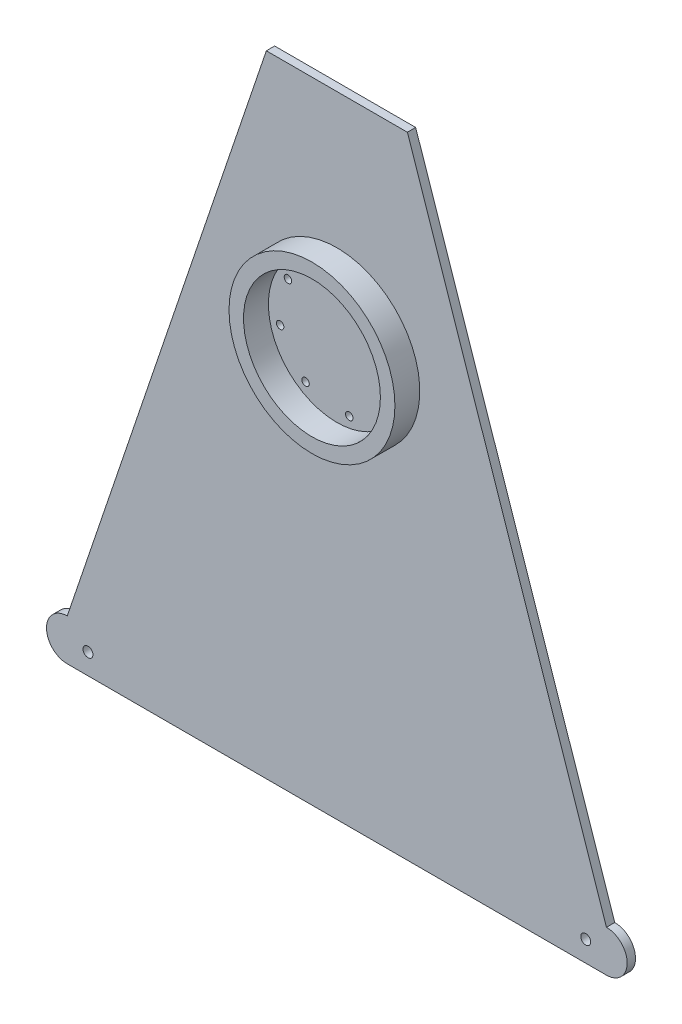
ISO-10303-21;
HEADER;
FILE_DESCRIPTION(('STEP AP214'),'2;1');
FILE_NAME('part.step','',(''),(''),'','','');
FILE_SCHEMA(('AUTOMOTIVE_DESIGN { 1 0 10303 214 1 1 1 1 }'));
ENDSEC;
DATA;
#1=APPLICATION_CONTEXT('core data for automotive mechanical design processes');
#2=APPLICATION_PROTOCOL_DEFINITION('international standard','automotive_design',2000,#1);
#3=PRODUCT_CONTEXT('',#1,'mechanical');
#4=PRODUCT('Part','Part','',(#3));
#5=PRODUCT_RELATED_PRODUCT_CATEGORY('part','',(#4));
#6=PRODUCT_DEFINITION_FORMATION('','',#4);
#7=PRODUCT_DEFINITION_CONTEXT('part definition',#1,'design');
#8=PRODUCT_DEFINITION('design','',#6,#7);
#9=PRODUCT_DEFINITION_SHAPE('','',#8);
#10=(LENGTH_UNIT() NAMED_UNIT(*) SI_UNIT(.MILLI.,.METRE.));
#11=(NAMED_UNIT(*) PLANE_ANGLE_UNIT() SI_UNIT($,.RADIAN.));
#12=(NAMED_UNIT(*) SI_UNIT($,.STERADIAN.) SOLID_ANGLE_UNIT());
#13=UNCERTAINTY_MEASURE_WITH_UNIT(LENGTH_MEASURE(1.E-05),#10,'distance_accuracy_value','');
#14=(GEOMETRIC_REPRESENTATION_CONTEXT(3) GLOBAL_UNCERTAINTY_ASSIGNED_CONTEXT((#13)) GLOBAL_UNIT_ASSIGNED_CONTEXT((#10,
#11,#12)) REPRESENTATION_CONTEXT('',''));
#15=CARTESIAN_POINT('',(0.,0.,0.));
#16=DIRECTION('',(0.,0.,1.));
#17=DIRECTION('',(1.,0.,0.));
#18=AXIS2_PLACEMENT_3D('',#15,#16,#17);
#19=CARTESIAN_POINT('',(325.,0.,10.));
#20=DIRECTION('',(0.,0.,-1.));
#21=DIRECTION('',(-1.,0.,0.));
#22=AXIS2_PLACEMENT_3D('',#19,#20,#21);
#23=CYLINDRICAL_SURFACE('',#22,25.);
#24=DIRECTION('',(0.,0.,-1.));
#25=VECTOR('',#24,1.);
#26=CARTESIAN_POINT('',(325.,25.,10.));
#27=LINE('',#26,#25);
#28=CARTESIAN_POINT('',(325.,25.,10.));
#29=VERTEX_POINT('',#28);
#30=CARTESIAN_POINT('',(325.,25.,0.));
#31=VERTEX_POINT('',#30);
#32=EDGE_CURVE('E118',#29,#31,#27,.T.);
#33=ORIENTED_EDGE('',*,*,#32,.F.);
#34=CARTESIAN_POINT('',(325.,0.,10.));
#35=DIRECTION('',(0.,0.,-1.));
#36=DIRECTION('',(-1.,0.,0.));
#37=AXIS2_PLACEMENT_3D('',#34,#35,#36);
#38=CIRCLE('',#37,25.);
#39=CARTESIAN_POINT('',(325.,-25.,10.));
#40=VERTEX_POINT('',#39);
#41=EDGE_CURVE('E63',#40,#29,#38,.F.);
#42=ORIENTED_EDGE('',*,*,#41,.F.);
#43=DIRECTION('',(0.,0.,-1.));
#44=VECTOR('',#43,1.);
#45=CARTESIAN_POINT('',(325.,-25.,10.));
#46=LINE('',#45,#44);
#47=CARTESIAN_POINT('',(325.,-25.,0.));
#48=VERTEX_POINT('',#47);
#49=EDGE_CURVE('E173',#48,#40,#46,.F.);
#50=ORIENTED_EDGE('',*,*,#49,.F.);
#51=CARTESIAN_POINT('',(325.,0.,0.));
#52=DIRECTION('',(0.,0.,-1.));
#53=DIRECTION('',(-1.,0.,0.));
#54=AXIS2_PLACEMENT_3D('',#51,#52,#53);
#55=CIRCLE('',#54,25.);
#56=EDGE_CURVE('E50',#31,#48,#55,.T.);
#57=ORIENTED_EDGE('',*,*,#56,.F.);
#58=EDGE_LOOP('',(#33,#42,#50,#57));
#59=FACE_BOUND('',#58,.T.);
#60=ADVANCED_FACE('F41',(#59),#23,.T.);
#61=CARTESIAN_POINT('',(-325.,0.,0.));
#62=DIRECTION('',(0.,0.,-1.));
#63=DIRECTION('',(-1.,0.,0.));
#64=AXIS2_PLACEMENT_3D('',#61,#62,#63);
#65=CYLINDRICAL_SURFACE('',#64,25.);
#66=DIRECTION('',(0.,0.,-1.));
#67=VECTOR('',#66,1.);
#68=CARTESIAN_POINT('',(-325.,25.,10.));
#69=LINE('',#68,#67);
#70=CARTESIAN_POINT('',(-325.,25.,0.));
#71=VERTEX_POINT('',#70);
#72=CARTESIAN_POINT('',(-325.,25.,10.));
#73=VERTEX_POINT('',#72);
#74=EDGE_CURVE('E154',#71,#73,#69,.F.);
#75=ORIENTED_EDGE('',*,*,#74,.F.);
#76=CARTESIAN_POINT('',(-325.,0.,0.));
#77=DIRECTION('',(0.,0.,-1.));
#78=DIRECTION('',(-1.,0.,0.));
#79=AXIS2_PLACEMENT_3D('',#76,#77,#78);
#80=CIRCLE('',#79,25.);
#81=CARTESIAN_POINT('',(-325.,-25.,0.));
#82=VERTEX_POINT('',#81);
#83=EDGE_CURVE('E165',#82,#71,#80,.T.);
#84=ORIENTED_EDGE('',*,*,#83,.F.);
#85=DIRECTION('',(0.,0.,-1.));
#86=VECTOR('',#85,1.);
#87=CARTESIAN_POINT('',(-325.,-25.,10.));
#88=LINE('',#87,#86);
#89=CARTESIAN_POINT('',(-325.,-25.,10.));
#90=VERTEX_POINT('',#89);
#91=EDGE_CURVE('E161',#90,#82,#88,.T.);
#92=ORIENTED_EDGE('',*,*,#91,.F.);
#93=CARTESIAN_POINT('',(-325.,0.,10.));
#94=DIRECTION('',(0.,0.,-1.));
#95=DIRECTION('',(-1.,0.,0.));
#96=AXIS2_PLACEMENT_3D('',#93,#94,#95);
#97=CIRCLE('',#96,25.);
#98=EDGE_CURVE('E168',#73,#90,#97,.F.);
#99=ORIENTED_EDGE('',*,*,#98,.F.);
#100=EDGE_LOOP('',(#75,#84,#92,#99));
#101=FACE_BOUND('',#100,.T.);
#102=ADVANCED_FACE('F308',(#101),#65,.T.);
#103=CARTESIAN_POINT('',(0.,0.,10.));
#104=DIRECTION('',(0.,0.,-1.));
#105=DIRECTION('',(-1.,0.,0.));
#106=AXIS2_PLACEMENT_3D('',#103,#104,#105);
#107=PLANE('',#106);
#108=CARTESIAN_POINT('',(0.,472.,10.));
#109=DIRECTION('',(0.,0.,-1.));
#110=DIRECTION('',(-1.,0.,0.));
#111=AXIS2_PLACEMENT_3D('',#108,#109,#110);
#112=CIRCLE('',#111,100.);
#113=CARTESIAN_POINT('',(-100.,472.,10.));
#114=VERTEX_POINT('',#113);
#115=EDGE_CURVE('E11',#114,#114,#112,.F.);
#116=ORIENTED_EDGE('',*,*,#115,.F.);
#117=EDGE_LOOP('',(#116));
#118=FACE_BOUND('',#117,.T.);
#119=DIRECTION('',(1.,0.,0.));
#120=VECTOR('',#119,1.);
#121=CARTESIAN_POINT('',(-350.,-25.,10.));
#122=LINE('',#121,#120);
#123=EDGE_CURVE('E150',#90,#40,#122,.T.);
#124=ORIENTED_EDGE('',*,*,#123,.T.);
#125=ORIENTED_EDGE('',*,*,#41,.T.);
#126=DIRECTION('',(-0.320227798569515,0.947340570768149,0.));
#127=VECTOR('',#126,1.);
#128=CARTESIAN_POINT('',(85.,735.,10.));
#129=LINE('',#128,#127);
#130=CARTESIAN_POINT('',(85.,735.,10.));
#131=VERTEX_POINT('',#130);
#132=EDGE_CURVE('E127',#29,#131,#129,.T.);
#133=ORIENTED_EDGE('',*,*,#132,.T.);
#134=DIRECTION('',(-1.,0.,0.));
#135=VECTOR('',#134,1.);
#136=CARTESIAN_POINT('',(-85.,735.,10.));
#137=LINE('',#136,#135);
#138=CARTESIAN_POINT('',(-85.,735.,10.));
#139=VERTEX_POINT('',#138);
#140=EDGE_CURVE('E111',#131,#139,#137,.T.);
#141=ORIENTED_EDGE('',*,*,#140,.T.);
#142=DIRECTION('',(-0.320227798569515,-0.947340570768149,0.));
#143=VECTOR('',#142,1.);
#144=CARTESIAN_POINT('',(-325.,25.,10.));
#145=LINE('',#144,#143);
#146=EDGE_CURVE('E120',#139,#73,#145,.T.);
#147=ORIENTED_EDGE('',*,*,#146,.T.);
#148=ORIENTED_EDGE('',*,*,#98,.T.);
#149=EDGE_LOOP('',(#124,#125,#133,#141,#147,#148));
#150=FACE_BOUND('',#149,.T.);
#151=CARTESIAN_POINT('',(-300.,0.,10.));
#152=DIRECTION('',(0.,0.,1.));
#153=DIRECTION('',(1.,0.,0.));
#154=AXIS2_PLACEMENT_3D('',#151,#152,#153);
#155=CIRCLE('',#154,5.99999999999999);
#156=CARTESIAN_POINT('',(-294.,0.,10.));
#157=VERTEX_POINT('',#156);
#158=EDGE_CURVE('E142',#157,#157,#155,.T.);
#159=ORIENTED_EDGE('',*,*,#158,.F.);
#160=EDGE_LOOP('',(#159));
#161=FACE_BOUND('',#160,.T.);
#162=CARTESIAN_POINT('',(300.,0.,10.));
#163=DIRECTION('',(0.,0.,1.));
#164=DIRECTION('',(1.,0.,0.));
#165=AXIS2_PLACEMENT_3D('',#162,#163,#164);
#166=CIRCLE('',#165,5.99999999999999);
#167=CARTESIAN_POINT('',(306.,0.,10.));
#168=VERTEX_POINT('',#167);
#169=EDGE_CURVE('E134',#168,#168,#166,.T.);
#170=ORIENTED_EDGE('',*,*,#169,.F.);
#171=EDGE_LOOP('',(#170));
#172=FACE_BOUND('',#171,.T.);
#173=ADVANCED_FACE('F179',(#118,#150,#161,#172),#107,.F.);
#174=CARTESIAN_POINT('',(0.,0.,0.));
#175=DIRECTION('',(0.,0.,-1.));
#176=DIRECTION('',(-1.,0.,0.));
#177=AXIS2_PLACEMENT_3D('',#174,#175,#176);
#178=PLANE('',#177);
#179=CARTESIAN_POINT('',(15.0022039899516,403.626511896468,0.));
#180=DIRECTION('',(0.,0.,1.));
#181=DIRECTION('',(0.707106781186546,0.707106781186549,0.));
#182=AXIS2_PLACEMENT_3D('',#179,#180,#181);
#183=CIRCLE('',#182,4.5);
#184=CARTESIAN_POINT('',(18.184184505291,406.808492411807,0.));
#185=VERTEX_POINT('',#184);
#186=EDGE_CURVE('E204',#185,#185,#183,.T.);
#187=ORIENTED_EDGE('',*,*,#186,.T.);
#188=EDGE_LOOP('',(#187));
#189=FACE_BOUND('',#188,.T.);
#190=CARTESIAN_POINT('',(58.9555172654241,434.260803082653,0.));
#191=DIRECTION('',(0.,0.,1.));
#192=DIRECTION('',(0.,1.,0.));
#193=AXIS2_PLACEMENT_3D('',#190,#191,#192);
#194=CIRCLE('',#193,4.5);
#195=CARTESIAN_POINT('',(58.9555172654241,438.760803082653,0.));
#196=VERTEX_POINT('',#195);
#197=EDGE_CURVE('E252',#196,#196,#194,.T.);
#198=ORIENTED_EDGE('',*,*,#197,.T.);
#199=EDGE_LOOP('',(#198));
#200=FACE_BOUND('',#199,.T.);
#201=CARTESIAN_POINT('',(68.3734881035323,487.002203989952,0.));
#202=DIRECTION('',(0.,0.,1.));
#203=DIRECTION('',(-0.707106781186551,0.707106781186544,0.));
#204=AXIS2_PLACEMENT_3D('',#201,#202,#203);
#205=CIRCLE('',#204,4.5);
#206=CARTESIAN_POINT('',(65.1915075881928,490.184184505291,0.));
#207=VERTEX_POINT('',#206);
#208=EDGE_CURVE('E244',#207,#207,#205,.T.);
#209=ORIENTED_EDGE('',*,*,#208,.T.);
#210=EDGE_LOOP('',(#209));
#211=FACE_BOUND('',#210,.T.);
#212=CARTESIAN_POINT('',(37.739196917347,530.955517265424,0.));
#213=DIRECTION('',(0.,0.,1.));
#214=DIRECTION('',(-1.,0.,0.));
#215=AXIS2_PLACEMENT_3D('',#212,#213,#214);
#216=CIRCLE('',#215,4.5);
#217=CARTESIAN_POINT('',(33.239196917347,530.955517265424,0.));
#218=VERTEX_POINT('',#217);
#219=EDGE_CURVE('E236',#218,#218,#216,.T.);
#220=ORIENTED_EDGE('',*,*,#219,.T.);
#221=EDGE_LOOP('',(#220));
#222=FACE_BOUND('',#221,.T.);
#223=CARTESIAN_POINT('',(-15.002203989952,540.373488103532,0.));
#224=DIRECTION('',(0.,0.,1.));
#225=DIRECTION('',(-0.707106781186541,-0.707106781186554,0.));
#226=AXIS2_PLACEMENT_3D('',#223,#224,#225);
#227=CIRCLE('',#226,4.5);
#228=CARTESIAN_POINT('',(-18.1841845052914,537.191507588193,0.));
#229=VERTEX_POINT('',#228);
#230=EDGE_CURVE('E228',#229,#229,#227,.T.);
#231=ORIENTED_EDGE('',*,*,#230,.T.);
#232=EDGE_LOOP('',(#231));
#233=FACE_BOUND('',#232,.T.);
#234=CARTESIAN_POINT('',(-58.9555172654244,509.739196917346,0.));
#235=DIRECTION('',(0.,0.,1.));
#236=DIRECTION('',(0.,-1.,0.));
#237=AXIS2_PLACEMENT_3D('',#234,#235,#236);
#238=CIRCLE('',#237,4.5);
#239=CARTESIAN_POINT('',(-58.9555172654244,505.239196917346,0.));
#240=VERTEX_POINT('',#239);
#241=EDGE_CURVE('E220',#240,#240,#238,.T.);
#242=ORIENTED_EDGE('',*,*,#241,.T.);
#243=EDGE_LOOP('',(#242));
#244=FACE_BOUND('',#243,.T.);
#245=CARTESIAN_POINT('',(-68.3734881035322,456.997796010048,0.));
#246=DIRECTION('',(0.,0.,1.));
#247=DIRECTION('',(0.707106781186556,-0.707106781186539,0.));
#248=AXIS2_PLACEMENT_3D('',#245,#246,#247);
#249=CIRCLE('',#248,4.5);
#250=CARTESIAN_POINT('',(-65.1915075881927,453.815815494708,0.));
#251=VERTEX_POINT('',#250);
#252=EDGE_CURVE('E212',#251,#251,#249,.T.);
#253=ORIENTED_EDGE('',*,*,#252,.T.);
#254=EDGE_LOOP('',(#253));
#255=FACE_BOUND('',#254,.T.);
#256=CARTESIAN_POINT('',(-37.739196917347,413.044482734576,0.));
#257=DIRECTION('',(0.,0.,1.));
#258=DIRECTION('',(1.,0.,0.));
#259=AXIS2_PLACEMENT_3D('',#256,#257,#258);
#260=CIRCLE('',#259,4.5);
#261=CARTESIAN_POINT('',(-33.239196917347,413.044482734576,0.));
#262=VERTEX_POINT('',#261);
#263=EDGE_CURVE('E198',#262,#262,#260,.T.);
#264=ORIENTED_EDGE('',*,*,#263,.T.);
#265=EDGE_LOOP('',(#264));
#266=FACE_BOUND('',#265,.T.);
#267=CARTESIAN_POINT('',(-300.,0.,0.));
#268=DIRECTION('',(0.,0.,1.));
#269=DIRECTION('',(1.,0.,0.));
#270=AXIS2_PLACEMENT_3D('',#267,#268,#269);
#271=CIRCLE('',#270,5.99999999999999);
#272=CARTESIAN_POINT('',(-294.,0.,0.));
#273=VERTEX_POINT('',#272);
#274=EDGE_CURVE('E138',#273,#273,#271,.T.);
#275=ORIENTED_EDGE('',*,*,#274,.T.);
#276=EDGE_LOOP('',(#275));
#277=FACE_BOUND('',#276,.T.);
#278=ORIENTED_EDGE('',*,*,#83,.T.);
#279=DIRECTION('',(-0.320227798569515,-0.947340570768149,0.));
#280=VECTOR('',#279,1.);
#281=CARTESIAN_POINT('',(-325.,25.,0.));
#282=LINE('',#281,#280);
#283=CARTESIAN_POINT('',(-85.,735.,0.));
#284=VERTEX_POINT('',#283);
#285=EDGE_CURVE('E101',#284,#71,#282,.T.);
#286=ORIENTED_EDGE('',*,*,#285,.F.);
#287=DIRECTION('',(-1.,0.,0.));
#288=VECTOR('',#287,1.);
#289=CARTESIAN_POINT('',(-85.,735.,0.));
#290=LINE('',#289,#288);
#291=CARTESIAN_POINT('',(85.,735.,0.));
#292=VERTEX_POINT('',#291);
#293=EDGE_CURVE('E93',#292,#284,#290,.T.);
#294=ORIENTED_EDGE('',*,*,#293,.F.);
#295=DIRECTION('',(-0.320227798569515,0.947340570768149,0.));
#296=VECTOR('',#295,1.);
#297=CARTESIAN_POINT('',(85.,735.,0.));
#298=LINE('',#297,#296);
#299=EDGE_CURVE('E98',#31,#292,#298,.T.);
#300=ORIENTED_EDGE('',*,*,#299,.F.);
#301=ORIENTED_EDGE('',*,*,#56,.T.);
#302=DIRECTION('',(1.,0.,0.));
#303=VECTOR('',#302,1.);
#304=CARTESIAN_POINT('',(-350.,-25.,0.));
#305=LINE('',#304,#303);
#306=EDGE_CURVE('E146',#82,#48,#305,.T.);
#307=ORIENTED_EDGE('',*,*,#306,.F.);
#308=EDGE_LOOP('',(#278,#286,#294,#300,#301,#307));
#309=FACE_BOUND('',#308,.T.);
#310=CARTESIAN_POINT('',(300.,0.,0.));
#311=DIRECTION('',(0.,0.,1.));
#312=DIRECTION('',(1.,0.,0.));
#313=AXIS2_PLACEMENT_3D('',#310,#311,#312);
#314=CIRCLE('',#313,5.99999999999999);
#315=CARTESIAN_POINT('',(306.,0.,0.));
#316=VERTEX_POINT('',#315);
#317=EDGE_CURVE('E130',#316,#316,#314,.T.);
#318=ORIENTED_EDGE('',*,*,#317,.T.);
#319=EDGE_LOOP('',(#318));
#320=FACE_BOUND('',#319,.T.);
#321=ADVANCED_FACE('F95',(#189,#200,#211,#222,#233,#244,#255,#266,#277,#309,#320),#178,.T.);
#322=CARTESIAN_POINT('',(-350.,-25.,10.));
#323=DIRECTION('',(0.,1.,0.));
#324=DIRECTION('',(0.,0.,1.));
#325=AXIS2_PLACEMENT_3D('',#322,#323,#324);
#326=PLANE('',#325);
#327=ORIENTED_EDGE('',*,*,#306,.T.);
#328=ORIENTED_EDGE('',*,*,#49,.T.);
#329=ORIENTED_EDGE('',*,*,#123,.F.);
#330=ORIENTED_EDGE('',*,*,#91,.T.);
#331=EDGE_LOOP('',(#327,#328,#329,#330));
#332=FACE_BOUND('',#331,.T.);
#333=ADVANCED_FACE('F322',(#332),#326,.F.);
#334=CARTESIAN_POINT('',(-300.,0.,10.));
#335=DIRECTION('',(0.,0.,-1.));
#336=DIRECTION('',(-1.,0.,0.));
#337=AXIS2_PLACEMENT_3D('',#334,#335,#336);
#338=CYLINDRICAL_SURFACE('',#337,5.99999999999999);
#339=ORIENTED_EDGE('',*,*,#158,.T.);
#340=EDGE_LOOP('',(#339));
#341=FACE_BOUND('',#340,.T.);
#342=ORIENTED_EDGE('',*,*,#274,.F.);
#343=EDGE_LOOP('',(#342));
#344=FACE_BOUND('',#343,.T.);
#345=ADVANCED_FACE('F325',(#341,#344),#338,.F.);
#346=CARTESIAN_POINT('',(300.,0.,10.));
#347=DIRECTION('',(0.,0.,-1.));
#348=DIRECTION('',(-1.,0.,0.));
#349=AXIS2_PLACEMENT_3D('',#346,#347,#348);
#350=CYLINDRICAL_SURFACE('',#349,5.99999999999999);
#351=ORIENTED_EDGE('',*,*,#169,.T.);
#352=EDGE_LOOP('',(#351));
#353=FACE_BOUND('',#352,.T.);
#354=ORIENTED_EDGE('',*,*,#317,.F.);
#355=EDGE_LOOP('',(#354));
#356=FACE_BOUND('',#355,.T.);
#357=ADVANCED_FACE('F331',(#353,#356),#350,.F.);
#358=CARTESIAN_POINT('',(85.,735.,-962.60064408871));
#359=DIRECTION('',(0.947340570768149,0.320227798569515,0.));
#360=DIRECTION('',(-0.320227798569515,0.947340570768149,0.));
#361=AXIS2_PLACEMENT_3D('',#358,#359,#360);
#362=PLANE('',#361);
#363=ORIENTED_EDGE('',*,*,#32,.T.);
#364=ORIENTED_EDGE('',*,*,#299,.T.);
#365=DIRECTION('',(0.,0.,1.));
#366=VECTOR('',#365,1.);
#367=CARTESIAN_POINT('',(85.,735.,-962.60064408871));
#368=LINE('',#367,#366);
#369=EDGE_CURVE('E106',#292,#131,#368,.T.);
#370=ORIENTED_EDGE('',*,*,#369,.T.);
#371=ORIENTED_EDGE('',*,*,#132,.F.);
#372=EDGE_LOOP('',(#363,#364,#370,#371));
#373=FACE_BOUND('',#372,.T.);
#374=ADVANCED_FACE('F117',(#373),#362,.T.);
#375=CARTESIAN_POINT('',(-85.,735.,-962.60064408871));
#376=DIRECTION('',(0.,1.,0.));
#377=DIRECTION('',(0.,0.,1.));
#378=AXIS2_PLACEMENT_3D('',#375,#376,#377);
#379=PLANE('',#378);
#380=ORIENTED_EDGE('',*,*,#369,.F.);
#381=ORIENTED_EDGE('',*,*,#293,.T.);
#382=DIRECTION('',(0.,0.,1.));
#383=VECTOR('',#382,1.);
#384=CARTESIAN_POINT('',(-85.,735.,-962.60064408871));
#385=LINE('',#384,#383);
#386=EDGE_CURVE('E105',#284,#139,#385,.T.);
#387=ORIENTED_EDGE('',*,*,#386,.T.);
#388=ORIENTED_EDGE('',*,*,#140,.F.);
#389=EDGE_LOOP('',(#380,#381,#387,#388));
#390=FACE_BOUND('',#389,.T.);
#391=ADVANCED_FACE('F109',(#390),#379,.T.);
#392=CARTESIAN_POINT('',(-325.,25.,-962.60064408871));
#393=DIRECTION('',(-0.947340570768149,0.320227798569515,0.));
#394=DIRECTION('',(-0.320227798569515,-0.947340570768149,0.));
#395=AXIS2_PLACEMENT_3D('',#392,#393,#394);
#396=PLANE('',#395);
#397=ORIENTED_EDGE('',*,*,#386,.F.);
#398=ORIENTED_EDGE('',*,*,#285,.T.);
#399=ORIENTED_EDGE('',*,*,#74,.T.);
#400=ORIENTED_EDGE('',*,*,#146,.F.);
#401=EDGE_LOOP('',(#397,#398,#399,#400));
#402=FACE_BOUND('',#401,.T.);
#403=ADVANCED_FACE('F340',(#402),#396,.T.);
#404=CARTESIAN_POINT('',(0.,472.,40.));
#405=DIRECTION('',(0.,0.,1.));
#406=DIRECTION('',(1.,0.,0.));
#407=AXIS2_PLACEMENT_3D('',#404,#405,#406);
#408=PLANE('',#407);
#409=CARTESIAN_POINT('',(0.,472.,40.));
#410=DIRECTION('',(0.,0.,1.));
#411=DIRECTION('',(1.,0.,0.));
#412=AXIS2_PLACEMENT_3D('',#409,#410,#411);
#413=CIRCLE('',#412,100.);
#414=CARTESIAN_POINT('',(100.,472.,40.));
#415=VERTEX_POINT('',#414);
#416=EDGE_CURVE('E183',#415,#415,#413,.T.);
#417=ORIENTED_EDGE('',*,*,#416,.T.);
#418=EDGE_LOOP('',(#417));
#419=FACE_BOUND('',#418,.T.);
#420=CARTESIAN_POINT('',(0.,472.,40.));
#421=DIRECTION('',(0.,0.,1.));
#422=DIRECTION('',(1.,0.,0.));
#423=AXIS2_PLACEMENT_3D('',#420,#421,#422);
#424=CIRCLE('',#423,82.5);
#425=CARTESIAN_POINT('',(82.5,472.,40.));
#426=VERTEX_POINT('',#425);
#427=EDGE_CURVE('E187',#426,#426,#424,.T.);
#428=ORIENTED_EDGE('',*,*,#427,.F.);
#429=EDGE_LOOP('',(#428));
#430=FACE_BOUND('',#429,.T.);
#431=ADVANCED_FACE('F302',(#419,#430),#408,.T.);
#432=CARTESIAN_POINT('',(0.,472.,40.));
#433=DIRECTION('',(0.,0.,-1.));
#434=DIRECTION('',(-1.,0.,0.));
#435=AXIS2_PLACEMENT_3D('',#432,#433,#434);
#436=CYLINDRICAL_SURFACE('',#435,100.);
#437=ORIENTED_EDGE('',*,*,#416,.F.);
#438=EDGE_LOOP('',(#437));
#439=FACE_BOUND('',#438,.T.);
#440=ORIENTED_EDGE('',*,*,#115,.T.);
#441=EDGE_LOOP('',(#440));
#442=FACE_BOUND('',#441,.T.);
#443=ADVANCED_FACE('F296',(#439,#442),#436,.T.);
#444=CARTESIAN_POINT('',(0.,472.,40.));
#445=DIRECTION('',(0.,0.,-1.));
#446=DIRECTION('',(-1.,0.,0.));
#447=AXIS2_PLACEMENT_3D('',#444,#445,#446);
#448=CYLINDRICAL_SURFACE('',#447,82.5);
#449=ORIENTED_EDGE('',*,*,#427,.T.);
#450=EDGE_LOOP('',(#449));
#451=FACE_BOUND('',#450,.T.);
#452=CARTESIAN_POINT('',(0.,472.,10.));
#453=DIRECTION('',(0.,0.,1.));
#454=DIRECTION('',(1.,0.,0.));
#455=AXIS2_PLACEMENT_3D('',#452,#453,#454);
#456=CIRCLE('',#455,82.5);
#457=CARTESIAN_POINT('',(82.5,472.,10.));
#458=VERTEX_POINT('',#457);
#459=EDGE_CURVE('E193',#458,#458,#456,.T.);
#460=ORIENTED_EDGE('',*,*,#459,.F.);
#461=EDGE_LOOP('',(#460));
#462=FACE_BOUND('',#461,.T.);
#463=ADVANCED_FACE('F277',(#451,#462),#448,.F.);
#464=CARTESIAN_POINT('',(15.0022039899516,403.626511896468,10.));
#465=DIRECTION('',(0.,0.,1.));
#466=DIRECTION('',(0.707106781186546,0.707106781186549,0.));
#467=AXIS2_PLACEMENT_3D('',#464,#465,#466);
#468=CIRCLE('',#467,4.5);
#469=CARTESIAN_POINT('',(18.184184505291,406.808492411807,10.));
#470=VERTEX_POINT('',#469);
#471=EDGE_CURVE('E256',#470,#470,#468,.T.);
#472=ORIENTED_EDGE('',*,*,#471,.F.);
#473=EDGE_LOOP('',(#472));
#474=FACE_BOUND('',#473,.T.);
#475=CARTESIAN_POINT('',(58.9555172654241,434.260803082653,10.));
#476=DIRECTION('',(0.,0.,1.));
#477=DIRECTION('',(0.,1.,0.));
#478=AXIS2_PLACEMENT_3D('',#475,#476,#477);
#479=CIRCLE('',#478,4.5);
#480=CARTESIAN_POINT('',(58.9555172654241,438.760803082653,10.));
#481=VERTEX_POINT('',#480);
#482=EDGE_CURVE('E248',#481,#481,#479,.T.);
#483=ORIENTED_EDGE('',*,*,#482,.F.);
#484=EDGE_LOOP('',(#483));
#485=FACE_BOUND('',#484,.T.);
#486=CARTESIAN_POINT('',(68.3734881035323,487.002203989952,10.));
#487=DIRECTION('',(0.,0.,1.));
#488=DIRECTION('',(-0.707106781186551,0.707106781186544,0.));
#489=AXIS2_PLACEMENT_3D('',#486,#487,#488);
#490=CIRCLE('',#489,4.5);
#491=CARTESIAN_POINT('',(65.1915075881928,490.184184505291,10.));
#492=VERTEX_POINT('',#491);
#493=EDGE_CURVE('E240',#492,#492,#490,.T.);
#494=ORIENTED_EDGE('',*,*,#493,.F.);
#495=EDGE_LOOP('',(#494));
#496=FACE_BOUND('',#495,.T.);
#497=CARTESIAN_POINT('',(37.739196917347,530.955517265424,10.));
#498=DIRECTION('',(0.,0.,1.));
#499=DIRECTION('',(-1.,0.,0.));
#500=AXIS2_PLACEMENT_3D('',#497,#498,#499);
#501=CIRCLE('',#500,4.5);
#502=CARTESIAN_POINT('',(33.239196917347,530.955517265424,10.));
#503=VERTEX_POINT('',#502);
#504=EDGE_CURVE('E232',#503,#503,#501,.T.);
#505=ORIENTED_EDGE('',*,*,#504,.F.);
#506=EDGE_LOOP('',(#505));
#507=FACE_BOUND('',#506,.T.);
#508=CARTESIAN_POINT('',(-15.002203989952,540.373488103532,10.));
#509=DIRECTION('',(0.,0.,1.));
#510=DIRECTION('',(-0.707106781186541,-0.707106781186554,0.));
#511=AXIS2_PLACEMENT_3D('',#508,#509,#510);
#512=CIRCLE('',#511,4.5);
#513=CARTESIAN_POINT('',(-18.1841845052914,537.191507588193,10.));
#514=VERTEX_POINT('',#513);
#515=EDGE_CURVE('E224',#514,#514,#512,.T.);
#516=ORIENTED_EDGE('',*,*,#515,.F.);
#517=EDGE_LOOP('',(#516));
#518=FACE_BOUND('',#517,.T.);
#519=CARTESIAN_POINT('',(-58.9555172654244,509.739196917346,10.));
#520=DIRECTION('',(0.,0.,1.));
#521=DIRECTION('',(0.,-1.,0.));
#522=AXIS2_PLACEMENT_3D('',#519,#520,#521);
#523=CIRCLE('',#522,4.5);
#524=CARTESIAN_POINT('',(-58.9555172654244,505.239196917346,10.));
#525=VERTEX_POINT('',#524);
#526=EDGE_CURVE('E216',#525,#525,#523,.T.);
#527=ORIENTED_EDGE('',*,*,#526,.F.);
#528=EDGE_LOOP('',(#527));
#529=FACE_BOUND('',#528,.T.);
#530=CARTESIAN_POINT('',(-68.3734881035322,456.997796010048,10.));
#531=DIRECTION('',(0.,0.,1.));
#532=DIRECTION('',(0.707106781186556,-0.707106781186539,0.));
#533=AXIS2_PLACEMENT_3D('',#530,#531,#532);
#534=CIRCLE('',#533,4.5);
#535=CARTESIAN_POINT('',(-65.1915075881927,453.815815494708,10.));
#536=VERTEX_POINT('',#535);
#537=EDGE_CURVE('E208',#536,#536,#534,.T.);
#538=ORIENTED_EDGE('',*,*,#537,.F.);
#539=EDGE_LOOP('',(#538));
#540=FACE_BOUND('',#539,.T.);
#541=CARTESIAN_POINT('',(-37.739196917347,413.044482734576,10.));
#542=DIRECTION('',(0.,0.,1.));
#543=DIRECTION('',(1.,0.,0.));
#544=AXIS2_PLACEMENT_3D('',#541,#542,#543);
#545=CIRCLE('',#544,4.5);
#546=CARTESIAN_POINT('',(-33.239196917347,413.044482734576,10.));
#547=VERTEX_POINT('',#546);
#548=EDGE_CURVE('E200',#547,#547,#545,.T.);
#549=ORIENTED_EDGE('',*,*,#548,.F.);
#550=EDGE_LOOP('',(#549));
#551=FACE_BOUND('',#550,.T.);
#552=ORIENTED_EDGE('',*,*,#459,.T.);
#553=EDGE_LOOP('',(#552));
#554=FACE_BOUND('',#553,.T.);
#555=ADVANCED_FACE('F273',(#474,#485,#496,#507,#518,#529,#540,#551,#554),#107,.F.);
#556=CARTESIAN_POINT('',(-37.739196917347,413.044482734576,0.));
#557=DIRECTION('',(0.,0.,1.));
#558=DIRECTION('',(1.,0.,0.));
#559=AXIS2_PLACEMENT_3D('',#556,#557,#558);
#560=CYLINDRICAL_SURFACE('',#559,4.5);
#561=ORIENTED_EDGE('',*,*,#263,.F.);
#562=EDGE_LOOP('',(#561));
#563=FACE_BOUND('',#562,.T.);
#564=ORIENTED_EDGE('',*,*,#548,.T.);
#565=EDGE_LOOP('',(#564));
#566=FACE_BOUND('',#565,.T.);
#567=ADVANCED_FACE('F276',(#563,#566),#560,.F.);
#568=CARTESIAN_POINT('',(-68.3734881035322,456.997796010048,0.));
#569=DIRECTION('',(0.,0.,1.));
#570=DIRECTION('',(1.,0.,0.));
#571=AXIS2_PLACEMENT_3D('',#568,#569,#570);
#572=CYLINDRICAL_SURFACE('',#571,4.5);
#573=ORIENTED_EDGE('',*,*,#252,.F.);
#574=EDGE_LOOP('',(#573));
#575=FACE_BOUND('',#574,.T.);
#576=ORIENTED_EDGE('',*,*,#537,.T.);
#577=EDGE_LOOP('',(#576));
#578=FACE_BOUND('',#577,.T.);
#579=ADVANCED_FACE('F368',(#575,#578),#572,.F.);
#580=CARTESIAN_POINT('',(-58.9555172654244,509.739196917346,0.));
#581=DIRECTION('',(0.,0.,1.));
#582=DIRECTION('',(1.,0.,0.));
#583=AXIS2_PLACEMENT_3D('',#580,#581,#582);
#584=CYLINDRICAL_SURFACE('',#583,4.5);
#585=ORIENTED_EDGE('',*,*,#241,.F.);
#586=EDGE_LOOP('',(#585));
#587=FACE_BOUND('',#586,.T.);
#588=ORIENTED_EDGE('',*,*,#526,.T.);
#589=EDGE_LOOP('',(#588));
#590=FACE_BOUND('',#589,.T.);
#591=ADVANCED_FACE('F393',(#587,#590),#584,.F.);
#592=CARTESIAN_POINT('',(-15.002203989952,540.373488103532,0.));
#593=DIRECTION('',(0.,0.,1.));
#594=DIRECTION('',(1.,0.,0.));
#595=AXIS2_PLACEMENT_3D('',#592,#593,#594);
#596=CYLINDRICAL_SURFACE('',#595,4.5);
#597=ORIENTED_EDGE('',*,*,#230,.F.);
#598=EDGE_LOOP('',(#597));
#599=FACE_BOUND('',#598,.T.);
#600=ORIENTED_EDGE('',*,*,#515,.T.);
#601=EDGE_LOOP('',(#600));
#602=FACE_BOUND('',#601,.T.);
#603=ADVANCED_FACE('F403',(#599,#602),#596,.F.);
#604=CARTESIAN_POINT('',(37.739196917347,530.955517265424,0.));
#605=DIRECTION('',(0.,0.,1.));
#606=DIRECTION('',(1.,0.,0.));
#607=AXIS2_PLACEMENT_3D('',#604,#605,#606);
#608=CYLINDRICAL_SURFACE('',#607,4.5);
#609=ORIENTED_EDGE('',*,*,#219,.F.);
#610=EDGE_LOOP('',(#609));
#611=FACE_BOUND('',#610,.T.);
#612=ORIENTED_EDGE('',*,*,#504,.T.);
#613=EDGE_LOOP('',(#612));
#614=FACE_BOUND('',#613,.T.);
#615=ADVANCED_FACE('F413',(#611,#614),#608,.F.);
#616=CARTESIAN_POINT('',(68.3734881035323,487.002203989952,0.));
#617=DIRECTION('',(0.,0.,1.));
#618=DIRECTION('',(1.,0.,0.));
#619=AXIS2_PLACEMENT_3D('',#616,#617,#618);
#620=CYLINDRICAL_SURFACE('',#619,4.5);
#621=ORIENTED_EDGE('',*,*,#208,.F.);
#622=EDGE_LOOP('',(#621));
#623=FACE_BOUND('',#622,.T.);
#624=ORIENTED_EDGE('',*,*,#493,.T.);
#625=EDGE_LOOP('',(#624));
#626=FACE_BOUND('',#625,.T.);
#627=ADVANCED_FACE('F423',(#623,#626),#620,.F.);
#628=CARTESIAN_POINT('',(58.9555172654241,434.260803082653,0.));
#629=DIRECTION('',(0.,0.,1.));
#630=DIRECTION('',(1.,0.,0.));
#631=AXIS2_PLACEMENT_3D('',#628,#629,#630);
#632=CYLINDRICAL_SURFACE('',#631,4.5);
#633=ORIENTED_EDGE('',*,*,#197,.F.);
#634=EDGE_LOOP('',(#633));
#635=FACE_BOUND('',#634,.T.);
#636=ORIENTED_EDGE('',*,*,#482,.T.);
#637=EDGE_LOOP('',(#636));
#638=FACE_BOUND('',#637,.T.);
#639=ADVANCED_FACE('F269',(#635,#638),#632,.F.);
#640=CARTESIAN_POINT('',(15.0022039899516,403.626511896468,0.));
#641=DIRECTION('',(0.,0.,1.));
#642=DIRECTION('',(1.,0.,0.));
#643=AXIS2_PLACEMENT_3D('',#640,#641,#642);
#644=CYLINDRICAL_SURFACE('',#643,4.5);
#645=ORIENTED_EDGE('',*,*,#186,.F.);
#646=EDGE_LOOP('',(#645));
#647=FACE_BOUND('',#646,.T.);
#648=ORIENTED_EDGE('',*,*,#471,.T.);
#649=EDGE_LOOP('',(#648));
#650=FACE_BOUND('',#649,.T.);
#651=ADVANCED_FACE('F266',(#647,#650),#644,.F.);
#652=CLOSED_SHELL('',(#60,#102,#173,#321,#333,#345,#357,#374,#391,#403,#431,#443,#463,#555,#567,
#579,#591,#603,#615,#627,#639,#651));
#653=MANIFOLD_SOLID_BREP('B2',#652);
#654=ADVANCED_BREP_SHAPE_REPRESENTATION('',(#18,#653),#14);
#655=SHAPE_DEFINITION_REPRESENTATION(#9,#654);
ENDSEC;
END-ISO-10303-21;
